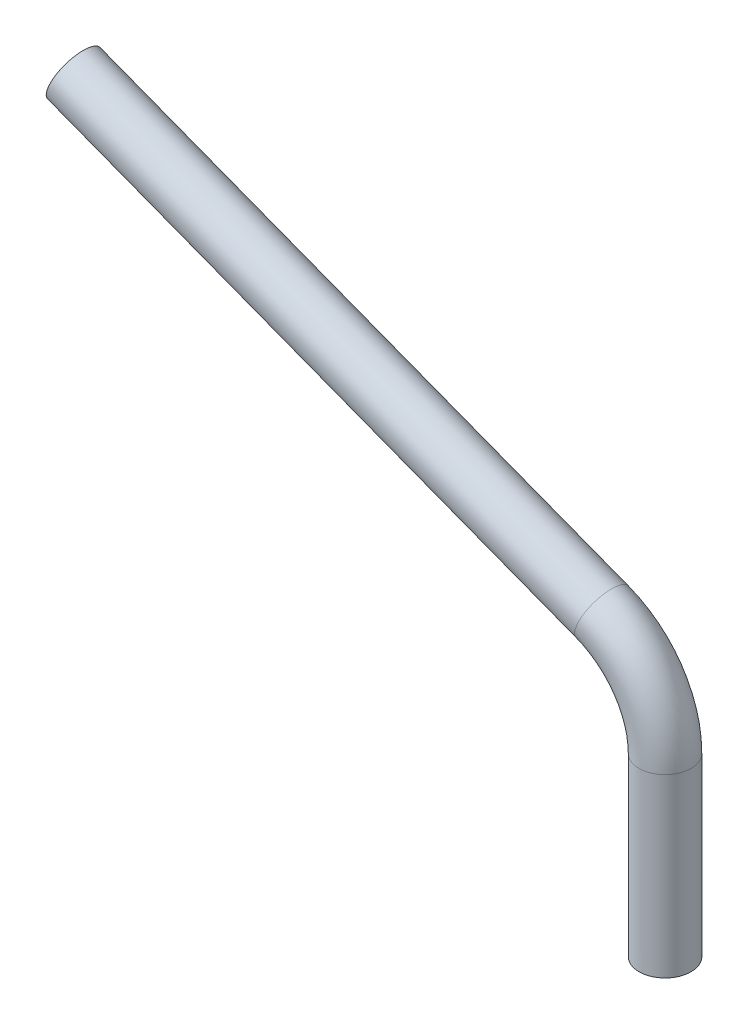
ISO-10303-21;
HEADER;
FILE_DESCRIPTION(('STEP AP214'),'2;1');
FILE_NAME('part.step','',(''),(''),'','','');
FILE_SCHEMA(('AUTOMOTIVE_DESIGN { 1 0 10303 214 1 1 1 1 }'));
ENDSEC;
DATA;
#1=APPLICATION_CONTEXT('core data for automotive mechanical design processes');
#2=APPLICATION_PROTOCOL_DEFINITION('international standard','automotive_design',2000,#1);
#3=PRODUCT_CONTEXT('',#1,'mechanical');
#4=PRODUCT('Part','Part','',(#3));
#5=PRODUCT_RELATED_PRODUCT_CATEGORY('part','',(#4));
#6=PRODUCT_DEFINITION_FORMATION('','',#4);
#7=PRODUCT_DEFINITION_CONTEXT('part definition',#1,'design');
#8=PRODUCT_DEFINITION('design','',#6,#7);
#9=PRODUCT_DEFINITION_SHAPE('','',#8);
#10=(LENGTH_UNIT() NAMED_UNIT(*) SI_UNIT(.MILLI.,.METRE.));
#11=(NAMED_UNIT(*) PLANE_ANGLE_UNIT() SI_UNIT($,.RADIAN.));
#12=(NAMED_UNIT(*) SI_UNIT($,.STERADIAN.) SOLID_ANGLE_UNIT());
#13=UNCERTAINTY_MEASURE_WITH_UNIT(LENGTH_MEASURE(1.E-05),#10,'distance_accuracy_value','');
#14=(GEOMETRIC_REPRESENTATION_CONTEXT(3) GLOBAL_UNCERTAINTY_ASSIGNED_CONTEXT((#13)) GLOBAL_UNIT_ASSIGNED_CONTEXT((#10,
#11,#12)) REPRESENTATION_CONTEXT('',''));
#15=CARTESIAN_POINT('',(0.,0.,0.));
#16=DIRECTION('',(0.,0.,1.));
#17=DIRECTION('',(1.,0.,0.));
#18=AXIS2_PLACEMENT_3D('',#15,#16,#17);
#19=CARTESIAN_POINT('',(-3.81,16.2047980391285,0.));
#20=DIRECTION('',(-0.933989725519648,0.357299863733158,0.));
#21=DIRECTION('',(-0.357299863733158,-0.933989725519648,0.));
#22=AXIS2_PLACEMENT_3D('',#19,#20,#21);
#23=CYLINDRICAL_SURFACE('',#22,1.5748);
#24=CARTESIAN_POINT('',(-3.81,16.2047980391285,0.));
#25=DIRECTION('',(-0.933989725519648,0.357299863733158,0.));
#26=DIRECTION('',(0.,0.,1.));
#27=AXIS2_PLACEMENT_3D('',#24,#25,#26);
#28=CIRCLE('',#27,1.5748);
#29=CARTESIAN_POINT('',(-3.24732417459302,17.6756450588768,0.));
#30=VERTEX_POINT('',#29);
#31=EDGE_CURVE('E41',#30,#30,#28,.T.);
#32=ORIENTED_EDGE('',*,*,#31,.T.);
#33=EDGE_LOOP('',(#32));
#34=FACE_BOUND('',#33,.T.);
#35=CARTESIAN_POINT('',(-35.814,28.448,0.));
#36=DIRECTION('',(-0.933989725519648,0.357299863733158,0.));
#37=DIRECTION('',(0.,0.,1.));
#38=AXIS2_PLACEMENT_3D('',#35,#36,#37);
#39=CIRCLE('',#38,1.5748);
#40=CARTESIAN_POINT('',(-35.814,28.448,1.5748));
#41=VERTEX_POINT('',#40);
#42=EDGE_CURVE('E10',#41,#41,#39,.T.);
#43=ORIENTED_EDGE('',*,*,#42,.F.);
#44=EDGE_LOOP('',(#43));
#45=FACE_BOUND('',#44,.T.);
#46=ADVANCED_FACE('F35',(#34,#45),#23,.T.);
#47=CARTESIAN_POINT('',(-5.92811450473713,10.668,0.));
#48=DIRECTION('',(0.,0.,1.));
#49=DIRECTION('',(1.,0.,0.));
#50=AXIS2_PLACEMENT_3D('',#47,#48,#49);
#51=TOROIDAL_SURFACE('',#50,5.92811450473714,1.5748);
#52=CARTESIAN_POINT('',(0.,10.668,0.));
#53=DIRECTION('',(0.,1.,0.));
#54=DIRECTION('',(0.,0.,1.));
#55=AXIS2_PLACEMENT_3D('',#52,#53,#54);
#56=CIRCLE('',#55,1.5748);
#57=CARTESIAN_POINT('',(1.57480000000001,10.668,0.));
#58=VERTEX_POINT('',#57);
#59=EDGE_CURVE('E45',#58,#58,#56,.T.);
#60=CARTESIAN_POINT('',(-5.92811450473713,10.668,0.));
#61=DIRECTION('',(0.,0.,1.));
#62=DIRECTION('',(1.,0.,0.));
#63=AXIS2_PLACEMENT_3D('',#60,#61,#62);
#64=CIRCLE('',#63,7.50291450473714);
#65=EDGE_CURVE('',#58,#30,#64,.T.);
#66=ORIENTED_EDGE('',*,*,#59,.T.);
#67=ORIENTED_EDGE('',*,*,#31,.F.);
#68=ORIENTED_EDGE('',*,*,#65,.T.);
#69=ORIENTED_EDGE('',*,*,#65,.F.);
#70=EDGE_LOOP('',(#66,#68,#67,#69));
#71=FACE_BOUND('',#70,.T.);
#72=ADVANCED_FACE('F67',(#71),#51,.T.);
#73=CARTESIAN_POINT('',(0.,10.668,0.));
#74=DIRECTION('',(0.,-1.,0.));
#75=DIRECTION('',(1.,0.,0.));
#76=AXIS2_PLACEMENT_3D('',#73,#74,#75);
#77=CYLINDRICAL_SURFACE('',#76,1.5748);
#78=ORIENTED_EDGE('',*,*,#59,.F.);
#79=EDGE_LOOP('',(#78));
#80=FACE_BOUND('',#79,.T.);
#81=CARTESIAN_POINT('',(0.,0.,0.));
#82=DIRECTION('',(0.,1.,0.));
#83=DIRECTION('',(0.,0.,1.));
#84=AXIS2_PLACEMENT_3D('',#81,#82,#83);
#85=CIRCLE('',#84,1.5748);
#86=CARTESIAN_POINT('',(0.,0.,1.5748));
#87=VERTEX_POINT('',#86);
#88=EDGE_CURVE('E49',#87,#87,#85,.T.);
#89=ORIENTED_EDGE('',*,*,#88,.T.);
#90=EDGE_LOOP('',(#89));
#91=FACE_BOUND('',#90,.T.);
#92=ADVANCED_FACE('F55',(#80,#91),#77,.T.);
#93=CARTESIAN_POINT('',(-35.814,28.448,0.));
#94=DIRECTION('',(-0.933989725519648,0.357299863733158,0.));
#95=DIRECTION('',(0.,0.,1.));
#96=AXIS2_PLACEMENT_3D('',#93,#94,#95);
#97=PLANE('',#96);
#98=ORIENTED_EDGE('',*,*,#42,.T.);
#99=EDGE_LOOP('',(#98));
#100=FACE_BOUND('',#99,.T.);
#101=ADVANCED_FACE('F59',(#100),#97,.T.);
#102=CARTESIAN_POINT('',(0.,0.,0.));
#103=DIRECTION('',(0.,1.,0.));
#104=DIRECTION('',(0.,0.,1.));
#105=AXIS2_PLACEMENT_3D('',#102,#103,#104);
#106=PLANE('',#105);
#107=ORIENTED_EDGE('',*,*,#88,.F.);
#108=EDGE_LOOP('',(#107));
#109=FACE_BOUND('',#108,.T.);
#110=ADVANCED_FACE('F57',(#109),#106,.F.);
#111=CLOSED_SHELL('',(#46,#72,#92,#101,#110));
#112=MANIFOLD_SOLID_BREP('B2',#111);
#113=ADVANCED_BREP_SHAPE_REPRESENTATION('',(#18,#112),#14);
#114=SHAPE_DEFINITION_REPRESENTATION(#9,#113);
ENDSEC;
END-ISO-10303-21;
